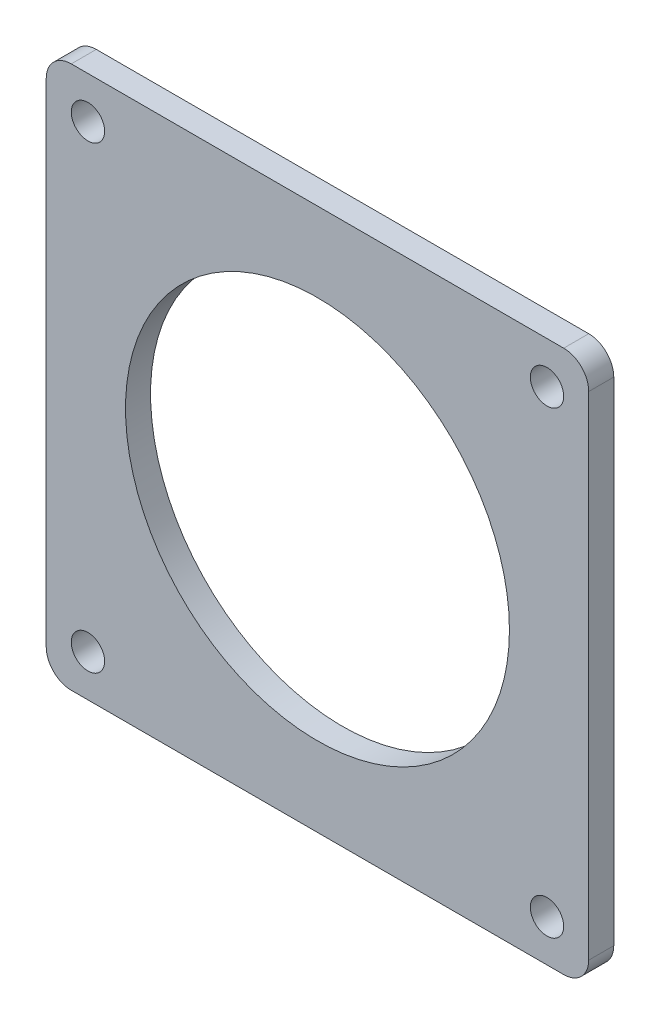
ISO-10303-21;
HEADER;
FILE_DESCRIPTION(('STEP AP214'),'2;1');
FILE_NAME('part.step','',(''),(''),'','','');
FILE_SCHEMA(('AUTOMOTIVE_DESIGN { 1 0 10303 214 1 1 1 1 }'));
ENDSEC;
DATA;
#1=APPLICATION_CONTEXT('core data for automotive mechanical design processes');
#2=APPLICATION_PROTOCOL_DEFINITION('international standard','automotive_design',2000,#1);
#3=PRODUCT_CONTEXT('',#1,'mechanical');
#4=PRODUCT('Part','Part','',(#3));
#5=PRODUCT_RELATED_PRODUCT_CATEGORY('part','',(#4));
#6=PRODUCT_DEFINITION_FORMATION('','',#4);
#7=PRODUCT_DEFINITION_CONTEXT('part definition',#1,'design');
#8=PRODUCT_DEFINITION('design','',#6,#7);
#9=PRODUCT_DEFINITION_SHAPE('','',#8);
#10=(LENGTH_UNIT() NAMED_UNIT(*) SI_UNIT(.MILLI.,.METRE.));
#11=(NAMED_UNIT(*) PLANE_ANGLE_UNIT() SI_UNIT($,.RADIAN.));
#12=(NAMED_UNIT(*) SI_UNIT($,.STERADIAN.) SOLID_ANGLE_UNIT());
#13=UNCERTAINTY_MEASURE_WITH_UNIT(LENGTH_MEASURE(1.E-05),#10,'distance_accuracy_value','');
#14=(GEOMETRIC_REPRESENTATION_CONTEXT(3) GLOBAL_UNCERTAINTY_ASSIGNED_CONTEXT((#13)) GLOBAL_UNIT_ASSIGNED_CONTEXT((#10,
#11,#12)) REPRESENTATION_CONTEXT('',''));
#15=CARTESIAN_POINT('',(0.,0.,0.));
#16=DIRECTION('',(0.,0.,1.));
#17=DIRECTION('',(1.,0.,0.));
#18=AXIS2_PLACEMENT_3D('',#15,#16,#17);
#19=CARTESIAN_POINT('',(0.,0.,3.));
#20=DIRECTION('',(0.,0.,1.));
#21=DIRECTION('',(1.,0.,0.));
#22=AXIS2_PLACEMENT_3D('',#19,#20,#21);
#23=PLANE('',#22);
#24=CARTESIAN_POINT('',(-27.5,-27.5,3.));
#25=DIRECTION('',(0.,0.,1.));
#26=DIRECTION('',(1.,0.,0.));
#27=AXIS2_PLACEMENT_3D('',#24,#25,#26);
#28=CIRCLE('',#27,2.);
#29=CARTESIAN_POINT('',(-25.5,-27.5,3.));
#30=VERTEX_POINT('',#29);
#31=EDGE_CURVE('E232',#30,#30,#28,.T.);
#32=ORIENTED_EDGE('',*,*,#31,.F.);
#33=EDGE_LOOP('',(#32));
#34=FACE_BOUND('',#33,.T.);
#35=CARTESIAN_POINT('',(27.5,27.5,3.));
#36=DIRECTION('',(0.,0.,1.));
#37=DIRECTION('',(1.,0.,0.));
#38=AXIS2_PLACEMENT_3D('',#35,#36,#37);
#39=CIRCLE('',#38,2.);
#40=CARTESIAN_POINT('',(29.5,27.5,3.));
#41=VERTEX_POINT('',#40);
#42=EDGE_CURVE('E218',#41,#41,#39,.T.);
#43=ORIENTED_EDGE('',*,*,#42,.F.);
#44=EDGE_LOOP('',(#43));
#45=FACE_BOUND('',#44,.T.);
#46=DIRECTION('',(-1.,0.,0.));
#47=VECTOR('',#46,1.);
#48=CARTESIAN_POINT('',(-32.5,32.5,3.));
#49=LINE('',#48,#47);
#50=CARTESIAN_POINT('',(29.5,32.5,3.));
#51=VERTEX_POINT('',#50);
#52=CARTESIAN_POINT('',(-29.5,32.5,3.));
#53=VERTEX_POINT('',#52);
#54=EDGE_CURVE('E198',#51,#53,#49,.T.);
#55=ORIENTED_EDGE('',*,*,#54,.T.);
#56=CARTESIAN_POINT('',(-29.5,29.5,3.));
#57=DIRECTION('',(0.,0.,1.));
#58=DIRECTION('',(1.,0.,0.));
#59=AXIS2_PLACEMENT_3D('',#56,#57,#58);
#60=CIRCLE('',#59,3.);
#61=CARTESIAN_POINT('',(-32.5,29.5,3.));
#62=VERTEX_POINT('',#61);
#63=EDGE_CURVE('E174',#53,#62,#60,.T.);
#64=ORIENTED_EDGE('',*,*,#63,.T.);
#65=DIRECTION('',(0.,-1.,0.));
#66=VECTOR('',#65,1.);
#67=CARTESIAN_POINT('',(-32.5,32.5,3.));
#68=LINE('',#67,#66);
#69=CARTESIAN_POINT('',(-32.5,-29.5,3.));
#70=VERTEX_POINT('',#69);
#71=EDGE_CURVE('E131',#62,#70,#68,.T.);
#72=ORIENTED_EDGE('',*,*,#71,.T.);
#73=CARTESIAN_POINT('',(-29.5,-29.5,3.));
#74=DIRECTION('',(0.,0.,1.));
#75=DIRECTION('',(1.,0.,0.));
#76=AXIS2_PLACEMENT_3D('',#73,#74,#75);
#77=CIRCLE('',#76,3.);
#78=CARTESIAN_POINT('',(-29.5,-32.5,3.));
#79=VERTEX_POINT('',#78);
#80=EDGE_CURVE('E66',#70,#79,#77,.T.);
#81=ORIENTED_EDGE('',*,*,#80,.T.);
#82=DIRECTION('',(1.,0.,0.));
#83=VECTOR('',#82,1.);
#84=CARTESIAN_POINT('',(-32.5,-32.5,3.));
#85=LINE('',#84,#83);
#86=CARTESIAN_POINT('',(29.5,-32.5,3.));
#87=VERTEX_POINT('',#86);
#88=EDGE_CURVE('E152',#79,#87,#85,.T.);
#89=ORIENTED_EDGE('',*,*,#88,.T.);
#90=CARTESIAN_POINT('',(29.5,-29.5,3.));
#91=DIRECTION('',(0.,0.,1.));
#92=DIRECTION('',(1.,0.,0.));
#93=AXIS2_PLACEMENT_3D('',#90,#91,#92);
#94=CIRCLE('',#93,3.);
#95=CARTESIAN_POINT('',(32.5,-29.5,3.));
#96=VERTEX_POINT('',#95);
#97=EDGE_CURVE('E169',#87,#96,#94,.T.);
#98=ORIENTED_EDGE('',*,*,#97,.T.);
#99=DIRECTION('',(0.,1.,0.));
#100=VECTOR('',#99,1.);
#101=CARTESIAN_POINT('',(32.5,32.5,3.));
#102=LINE('',#101,#100);
#103=CARTESIAN_POINT('',(32.5,29.5,3.));
#104=VERTEX_POINT('',#103);
#105=EDGE_CURVE('E145',#96,#104,#102,.T.);
#106=ORIENTED_EDGE('',*,*,#105,.T.);
#107=CARTESIAN_POINT('',(29.5,29.5,3.));
#108=DIRECTION('',(0.,0.,1.));
#109=DIRECTION('',(1.,0.,0.));
#110=AXIS2_PLACEMENT_3D('',#107,#108,#109);
#111=CIRCLE('',#110,3.);
#112=EDGE_CURVE('E166',#104,#51,#111,.T.);
#113=ORIENTED_EDGE('',*,*,#112,.T.);
#114=EDGE_LOOP('',(#55,#64,#72,#81,#89,#98,#106,#113));
#115=FACE_BOUND('',#114,.T.);
#116=CARTESIAN_POINT('',(-27.5,27.5,3.));
#117=DIRECTION('',(0.,0.,1.));
#118=DIRECTION('',(1.,0.,0.));
#119=AXIS2_PLACEMENT_3D('',#116,#117,#118);
#120=CIRCLE('',#119,2.);
#121=CARTESIAN_POINT('',(-25.5,27.5,3.));
#122=VERTEX_POINT('',#121);
#123=EDGE_CURVE('E204',#122,#122,#120,.T.);
#124=ORIENTED_EDGE('',*,*,#123,.F.);
#125=EDGE_LOOP('',(#124));
#126=FACE_BOUND('',#125,.T.);
#127=CARTESIAN_POINT('',(27.5,-27.5,3.));
#128=DIRECTION('',(0.,0.,1.));
#129=DIRECTION('',(1.,0.,0.));
#130=AXIS2_PLACEMENT_3D('',#127,#128,#129);
#131=CIRCLE('',#130,2.);
#132=CARTESIAN_POINT('',(29.5,-27.5,3.));
#133=VERTEX_POINT('',#132);
#134=EDGE_CURVE('E224',#133,#133,#131,.T.);
#135=ORIENTED_EDGE('',*,*,#134,.F.);
#136=EDGE_LOOP('',(#135));
#137=FACE_BOUND('',#136,.T.);
#138=CARTESIAN_POINT('',(0.,0.,3.));
#139=DIRECTION('',(0.,0.,1.));
#140=DIRECTION('',(1.,0.,0.));
#141=AXIS2_PLACEMENT_3D('',#138,#139,#140);
#142=CIRCLE('',#141,23.);
#143=CARTESIAN_POINT('',(23.,0.,3.));
#144=VERTEX_POINT('',#143);
#145=EDGE_CURVE('E240',#144,#144,#142,.T.);
#146=ORIENTED_EDGE('',*,*,#145,.F.);
#147=EDGE_LOOP('',(#146));
#148=FACE_BOUND('',#147,.T.);
#149=ADVANCED_FACE('F43',(#34,#45,#115,#126,#137,#148),#23,.T.);
#150=CARTESIAN_POINT('',(0.,0.,0.));
#151=DIRECTION('',(0.,0.,1.));
#152=DIRECTION('',(1.,0.,0.));
#153=AXIS2_PLACEMENT_3D('',#150,#151,#152);
#154=PLANE('',#153);
#155=DIRECTION('',(0.,-1.,0.));
#156=VECTOR('',#155,1.);
#157=CARTESIAN_POINT('',(-32.5,32.5,0.));
#158=LINE('',#157,#156);
#159=CARTESIAN_POINT('',(-32.5,29.5,0.));
#160=VERTEX_POINT('',#159);
#161=CARTESIAN_POINT('',(-32.5,-29.5,0.));
#162=VERTEX_POINT('',#161);
#163=EDGE_CURVE('E129',#160,#162,#158,.T.);
#164=ORIENTED_EDGE('',*,*,#163,.F.);
#165=CARTESIAN_POINT('',(-29.5,29.5,0.));
#166=DIRECTION('',(0.,0.,1.));
#167=DIRECTION('',(1.,0.,0.));
#168=AXIS2_PLACEMENT_3D('',#165,#166,#167);
#169=CIRCLE('',#168,3.);
#170=CARTESIAN_POINT('',(-29.5,32.5,0.));
#171=VERTEX_POINT('',#170);
#172=EDGE_CURVE('E111',#160,#171,#169,.F.);
#173=ORIENTED_EDGE('',*,*,#172,.T.);
#174=DIRECTION('',(-1.,0.,0.));
#175=VECTOR('',#174,1.);
#176=CARTESIAN_POINT('',(-32.5,32.5,0.));
#177=LINE('',#176,#175);
#178=CARTESIAN_POINT('',(29.5,32.5,0.));
#179=VERTEX_POINT('',#178);
#180=EDGE_CURVE('E141',#179,#171,#177,.T.);
#181=ORIENTED_EDGE('',*,*,#180,.F.);
#182=CARTESIAN_POINT('',(29.5,29.5,0.));
#183=DIRECTION('',(0.,0.,1.));
#184=DIRECTION('',(1.,0.,0.));
#185=AXIS2_PLACEMENT_3D('',#182,#183,#184);
#186=CIRCLE('',#185,3.);
#187=CARTESIAN_POINT('',(32.5,29.5,0.));
#188=VERTEX_POINT('',#187);
#189=EDGE_CURVE('E133',#179,#188,#186,.F.);
#190=ORIENTED_EDGE('',*,*,#189,.T.);
#191=DIRECTION('',(0.,1.,0.));
#192=VECTOR('',#191,1.);
#193=CARTESIAN_POINT('',(32.5,32.5,0.));
#194=LINE('',#193,#192);
#195=CARTESIAN_POINT('',(32.5,-29.5,0.));
#196=VERTEX_POINT('',#195);
#197=EDGE_CURVE('E147',#196,#188,#194,.T.);
#198=ORIENTED_EDGE('',*,*,#197,.F.);
#199=CARTESIAN_POINT('',(29.5,-29.5,0.));
#200=DIRECTION('',(0.,0.,1.));
#201=DIRECTION('',(1.,0.,0.));
#202=AXIS2_PLACEMENT_3D('',#199,#200,#201);
#203=CIRCLE('',#202,3.);
#204=CARTESIAN_POINT('',(29.5,-32.5,0.));
#205=VERTEX_POINT('',#204);
#206=EDGE_CURVE('E156',#196,#205,#203,.F.);
#207=ORIENTED_EDGE('',*,*,#206,.T.);
#208=DIRECTION('',(1.,0.,0.));
#209=VECTOR('',#208,1.);
#210=CARTESIAN_POINT('',(-32.5,-32.5,0.));
#211=LINE('',#210,#209);
#212=CARTESIAN_POINT('',(-29.5,-32.5,0.));
#213=VERTEX_POINT('',#212);
#214=EDGE_CURVE('E140',#213,#205,#211,.T.);
#215=ORIENTED_EDGE('',*,*,#214,.F.);
#216=CARTESIAN_POINT('',(-29.5,-29.5,0.));
#217=DIRECTION('',(0.,0.,1.));
#218=DIRECTION('',(1.,0.,0.));
#219=AXIS2_PLACEMENT_3D('',#216,#217,#218);
#220=CIRCLE('',#219,3.);
#221=EDGE_CURVE('E123',#213,#162,#220,.F.);
#222=ORIENTED_EDGE('',*,*,#221,.T.);
#223=EDGE_LOOP('',(#164,#173,#181,#190,#198,#207,#215,#222));
#224=FACE_BOUND('',#223,.T.);
#225=CARTESIAN_POINT('',(-27.5,27.5,0.));
#226=DIRECTION('',(0.,0.,1.));
#227=DIRECTION('',(1.,0.,0.));
#228=AXIS2_PLACEMENT_3D('',#225,#226,#227);
#229=CIRCLE('',#228,2.);
#230=CARTESIAN_POINT('',(-25.5,27.5,0.));
#231=VERTEX_POINT('',#230);
#232=EDGE_CURVE('E207',#231,#231,#229,.T.);
#233=ORIENTED_EDGE('',*,*,#232,.T.);
#234=EDGE_LOOP('',(#233));
#235=FACE_BOUND('',#234,.T.);
#236=CARTESIAN_POINT('',(27.5,27.5,0.));
#237=DIRECTION('',(0.,0.,1.));
#238=DIRECTION('',(1.,0.,0.));
#239=AXIS2_PLACEMENT_3D('',#236,#237,#238);
#240=CIRCLE('',#239,2.);
#241=CARTESIAN_POINT('',(29.5,27.5,0.));
#242=VERTEX_POINT('',#241);
#243=EDGE_CURVE('E220',#242,#242,#240,.T.);
#244=ORIENTED_EDGE('',*,*,#243,.T.);
#245=EDGE_LOOP('',(#244));
#246=FACE_BOUND('',#245,.T.);
#247=CARTESIAN_POINT('',(27.5,-27.5,0.));
#248=DIRECTION('',(0.,0.,1.));
#249=DIRECTION('',(1.,0.,0.));
#250=AXIS2_PLACEMENT_3D('',#247,#248,#249);
#251=CIRCLE('',#250,2.);
#252=CARTESIAN_POINT('',(29.5,-27.5,0.));
#253=VERTEX_POINT('',#252);
#254=EDGE_CURVE('E228',#253,#253,#251,.T.);
#255=ORIENTED_EDGE('',*,*,#254,.T.);
#256=EDGE_LOOP('',(#255));
#257=FACE_BOUND('',#256,.T.);
#258=CARTESIAN_POINT('',(-27.5,-27.5,0.));
#259=DIRECTION('',(0.,0.,1.));
#260=DIRECTION('',(1.,0.,0.));
#261=AXIS2_PLACEMENT_3D('',#258,#259,#260);
#262=CIRCLE('',#261,2.);
#263=CARTESIAN_POINT('',(-25.5,-27.5,0.));
#264=VERTEX_POINT('',#263);
#265=EDGE_CURVE('E236',#264,#264,#262,.T.);
#266=ORIENTED_EDGE('',*,*,#265,.T.);
#267=EDGE_LOOP('',(#266));
#268=FACE_BOUND('',#267,.T.);
#269=CARTESIAN_POINT('',(0.,0.,0.));
#270=DIRECTION('',(0.,0.,1.));
#271=DIRECTION('',(1.,0.,0.));
#272=AXIS2_PLACEMENT_3D('',#269,#270,#271);
#273=CIRCLE('',#272,23.);
#274=CARTESIAN_POINT('',(23.,0.,0.));
#275=VERTEX_POINT('',#274);
#276=EDGE_CURVE('E244',#275,#275,#273,.T.);
#277=ORIENTED_EDGE('',*,*,#276,.T.);
#278=EDGE_LOOP('',(#277));
#279=FACE_BOUND('',#278,.T.);
#280=ADVANCED_FACE('F136',(#224,#235,#246,#257,#268,#279),#154,.F.);
#281=CARTESIAN_POINT('',(32.5,32.5,3.));
#282=DIRECTION('',(-1.,0.,0.));
#283=DIRECTION('',(0.,-1.,0.));
#284=AXIS2_PLACEMENT_3D('',#281,#282,#283);
#285=PLANE('',#284);
#286=ORIENTED_EDGE('',*,*,#105,.F.);
#287=DIRECTION('',(0.,0.,-1.));
#288=VECTOR('',#287,1.);
#289=CARTESIAN_POINT('',(32.5,-29.5,3.));
#290=LINE('',#289,#288);
#291=EDGE_CURVE('E11',#96,#196,#290,.T.);
#292=ORIENTED_EDGE('',*,*,#291,.T.);
#293=ORIENTED_EDGE('',*,*,#197,.T.);
#294=DIRECTION('',(0.,0.,-1.));
#295=VECTOR('',#294,1.);
#296=CARTESIAN_POINT('',(32.5,29.5,3.));
#297=LINE('',#296,#295);
#298=EDGE_CURVE('E52',#188,#104,#297,.F.);
#299=ORIENTED_EDGE('',*,*,#298,.T.);
#300=EDGE_LOOP('',(#286,#292,#293,#299));
#301=FACE_BOUND('',#300,.T.);
#302=ADVANCED_FACE('F188',(#301),#285,.F.);
#303=CARTESIAN_POINT('',(-32.5,32.5,3.));
#304=DIRECTION('',(0.,-1.,0.));
#305=DIRECTION('',(0.,0.,-1.));
#306=AXIS2_PLACEMENT_3D('',#303,#304,#305);
#307=PLANE('',#306);
#308=ORIENTED_EDGE('',*,*,#180,.T.);
#309=DIRECTION('',(0.,0.,-1.));
#310=VECTOR('',#309,1.);
#311=CARTESIAN_POINT('',(-29.5,32.5,3.));
#312=LINE('',#311,#310);
#313=EDGE_CURVE('E116',#171,#53,#312,.F.);
#314=ORIENTED_EDGE('',*,*,#313,.T.);
#315=ORIENTED_EDGE('',*,*,#54,.F.);
#316=DIRECTION('',(0.,0.,-1.));
#317=VECTOR('',#316,1.);
#318=CARTESIAN_POINT('',(29.5,32.5,3.));
#319=LINE('',#318,#317);
#320=EDGE_CURVE('E122',#51,#179,#319,.T.);
#321=ORIENTED_EDGE('',*,*,#320,.T.);
#322=EDGE_LOOP('',(#308,#314,#315,#321));
#323=FACE_BOUND('',#322,.T.);
#324=ADVANCED_FACE('F202',(#323),#307,.F.);
#325=CARTESIAN_POINT('',(-32.5,32.5,3.));
#326=DIRECTION('',(1.,0.,0.));
#327=DIRECTION('',(0.,0.,-1.));
#328=AXIS2_PLACEMENT_3D('',#325,#326,#327);
#329=PLANE('',#328);
#330=ORIENTED_EDGE('',*,*,#71,.F.);
#331=DIRECTION('',(0.,0.,-1.));
#332=VECTOR('',#331,1.);
#333=CARTESIAN_POINT('',(-32.5,29.5,3.));
#334=LINE('',#333,#332);
#335=EDGE_CURVE('E115',#62,#160,#334,.T.);
#336=ORIENTED_EDGE('',*,*,#335,.T.);
#337=ORIENTED_EDGE('',*,*,#163,.T.);
#338=DIRECTION('',(0.,0.,-1.));
#339=VECTOR('',#338,1.);
#340=CARTESIAN_POINT('',(-32.5,-29.5,3.));
#341=LINE('',#340,#339);
#342=EDGE_CURVE('E134',#162,#70,#341,.F.);
#343=ORIENTED_EDGE('',*,*,#342,.T.);
#344=EDGE_LOOP('',(#330,#336,#337,#343));
#345=FACE_BOUND('',#344,.T.);
#346=ADVANCED_FACE('F128',(#345),#329,.F.);
#347=CARTESIAN_POINT('',(-32.5,-32.5,3.));
#348=DIRECTION('',(0.,1.,0.));
#349=DIRECTION('',(0.,0.,1.));
#350=AXIS2_PLACEMENT_3D('',#347,#348,#349);
#351=PLANE('',#350);
#352=ORIENTED_EDGE('',*,*,#88,.F.);
#353=DIRECTION('',(0.,0.,-1.));
#354=VECTOR('',#353,1.);
#355=CARTESIAN_POINT('',(-29.5,-32.5,3.));
#356=LINE('',#355,#354);
#357=EDGE_CURVE('E179',#79,#213,#356,.T.);
#358=ORIENTED_EDGE('',*,*,#357,.T.);
#359=ORIENTED_EDGE('',*,*,#214,.T.);
#360=DIRECTION('',(0.,0.,-1.));
#361=VECTOR('',#360,1.);
#362=CARTESIAN_POINT('',(29.5,-32.5,3.));
#363=LINE('',#362,#361);
#364=EDGE_CURVE('E59',#205,#87,#363,.F.);
#365=ORIENTED_EDGE('',*,*,#364,.T.);
#366=EDGE_LOOP('',(#352,#358,#359,#365));
#367=FACE_BOUND('',#366,.T.);
#368=ADVANCED_FACE('F268',(#367),#351,.F.);
#369=CARTESIAN_POINT('',(-27.5,27.5,3.));
#370=DIRECTION('',(0.,0.,-1.));
#371=DIRECTION('',(-1.,0.,0.));
#372=AXIS2_PLACEMENT_3D('',#369,#370,#371);
#373=CYLINDRICAL_SURFACE('',#372,2.);
#374=ORIENTED_EDGE('',*,*,#123,.T.);
#375=EDGE_LOOP('',(#374));
#376=FACE_BOUND('',#375,.T.);
#377=ORIENTED_EDGE('',*,*,#232,.F.);
#378=EDGE_LOOP('',(#377));
#379=FACE_BOUND('',#378,.T.);
#380=ADVANCED_FACE('F265',(#376,#379),#373,.F.);
#381=CARTESIAN_POINT('',(27.5,27.5,3.));
#382=DIRECTION('',(0.,0.,-1.));
#383=DIRECTION('',(-1.,0.,0.));
#384=AXIS2_PLACEMENT_3D('',#381,#382,#383);
#385=CYLINDRICAL_SURFACE('',#384,2.);
#386=ORIENTED_EDGE('',*,*,#42,.T.);
#387=EDGE_LOOP('',(#386));
#388=FACE_BOUND('',#387,.T.);
#389=ORIENTED_EDGE('',*,*,#243,.F.);
#390=EDGE_LOOP('',(#389));
#391=FACE_BOUND('',#390,.T.);
#392=ADVANCED_FACE('F382',(#388,#391),#385,.F.);
#393=CARTESIAN_POINT('',(27.5,-27.5,3.));
#394=DIRECTION('',(0.,0.,-1.));
#395=DIRECTION('',(-1.,0.,0.));
#396=AXIS2_PLACEMENT_3D('',#393,#394,#395);
#397=CYLINDRICAL_SURFACE('',#396,2.);
#398=ORIENTED_EDGE('',*,*,#134,.T.);
#399=EDGE_LOOP('',(#398));
#400=FACE_BOUND('',#399,.T.);
#401=ORIENTED_EDGE('',*,*,#254,.F.);
#402=EDGE_LOOP('',(#401));
#403=FACE_BOUND('',#402,.T.);
#404=ADVANCED_FACE('F371',(#400,#403),#397,.F.);
#405=CARTESIAN_POINT('',(-27.5,-27.5,3.));
#406=DIRECTION('',(0.,0.,-1.));
#407=DIRECTION('',(-1.,0.,0.));
#408=AXIS2_PLACEMENT_3D('',#405,#406,#407);
#409=CYLINDRICAL_SURFACE('',#408,2.);
#410=ORIENTED_EDGE('',*,*,#31,.T.);
#411=EDGE_LOOP('',(#410));
#412=FACE_BOUND('',#411,.T.);
#413=ORIENTED_EDGE('',*,*,#265,.F.);
#414=EDGE_LOOP('',(#413));
#415=FACE_BOUND('',#414,.T.);
#416=ADVANCED_FACE('F361',(#412,#415),#409,.F.);
#417=CARTESIAN_POINT('',(0.,0.,3.));
#418=DIRECTION('',(0.,0.,-1.));
#419=DIRECTION('',(-1.,0.,0.));
#420=AXIS2_PLACEMENT_3D('',#417,#418,#419);
#421=CYLINDRICAL_SURFACE('',#420,23.);
#422=ORIENTED_EDGE('',*,*,#145,.T.);
#423=EDGE_LOOP('',(#422));
#424=FACE_BOUND('',#423,.T.);
#425=ORIENTED_EDGE('',*,*,#276,.F.);
#426=EDGE_LOOP('',(#425));
#427=FACE_BOUND('',#426,.T.);
#428=ADVANCED_FACE('F252',(#424,#427),#421,.F.);
#429=CARTESIAN_POINT('',(-29.5,29.5,3.));
#430=DIRECTION('',(0.,0.,-1.));
#431=DIRECTION('',(-1.,0.,0.));
#432=AXIS2_PLACEMENT_3D('',#429,#430,#431);
#433=CYLINDRICAL_SURFACE('',#432,3.);
#434=ORIENTED_EDGE('',*,*,#63,.F.);
#435=ORIENTED_EDGE('',*,*,#313,.F.);
#436=ORIENTED_EDGE('',*,*,#172,.F.);
#437=ORIENTED_EDGE('',*,*,#335,.F.);
#438=EDGE_LOOP('',(#434,#435,#436,#437));
#439=FACE_BOUND('',#438,.T.);
#440=ADVANCED_FACE('F114',(#439),#433,.T.);
#441=CARTESIAN_POINT('',(-29.5,-29.5,3.));
#442=DIRECTION('',(0.,0.,-1.));
#443=DIRECTION('',(-1.,0.,0.));
#444=AXIS2_PLACEMENT_3D('',#441,#442,#443);
#445=CYLINDRICAL_SURFACE('',#444,3.);
#446=ORIENTED_EDGE('',*,*,#80,.F.);
#447=ORIENTED_EDGE('',*,*,#342,.F.);
#448=ORIENTED_EDGE('',*,*,#221,.F.);
#449=ORIENTED_EDGE('',*,*,#357,.F.);
#450=EDGE_LOOP('',(#446,#447,#448,#449));
#451=FACE_BOUND('',#450,.T.);
#452=ADVANCED_FACE('F279',(#451),#445,.T.);
#453=CARTESIAN_POINT('',(29.5,-29.5,3.));
#454=DIRECTION('',(0.,0.,-1.));
#455=DIRECTION('',(-1.,0.,0.));
#456=AXIS2_PLACEMENT_3D('',#453,#454,#455);
#457=CYLINDRICAL_SURFACE('',#456,3.);
#458=ORIENTED_EDGE('',*,*,#97,.F.);
#459=ORIENTED_EDGE('',*,*,#364,.F.);
#460=ORIENTED_EDGE('',*,*,#206,.F.);
#461=ORIENTED_EDGE('',*,*,#291,.F.);
#462=EDGE_LOOP('',(#458,#459,#460,#461));
#463=FACE_BOUND('',#462,.T.);
#464=ADVANCED_FACE('F281',(#463),#457,.T.);
#465=CARTESIAN_POINT('',(29.5,29.5,3.));
#466=DIRECTION('',(0.,0.,-1.));
#467=DIRECTION('',(-1.,0.,0.));
#468=AXIS2_PLACEMENT_3D('',#465,#466,#467);
#469=CYLINDRICAL_SURFACE('',#468,3.);
#470=ORIENTED_EDGE('',*,*,#112,.F.);
#471=ORIENTED_EDGE('',*,*,#298,.F.);
#472=ORIENTED_EDGE('',*,*,#189,.F.);
#473=ORIENTED_EDGE('',*,*,#320,.F.);
#474=EDGE_LOOP('',(#470,#471,#472,#473));
#475=FACE_BOUND('',#474,.T.);
#476=ADVANCED_FACE('F45',(#475),#469,.T.);
#477=CLOSED_SHELL('',(#149,#280,#302,#324,#346,#368,#380,#392,#404,#416,#428,#440,#452,#464,#476));
#478=MANIFOLD_SOLID_BREP('B2',#477);
#479=ADVANCED_BREP_SHAPE_REPRESENTATION('',(#18,#478),#14);
#480=SHAPE_DEFINITION_REPRESENTATION(#9,#479);
ENDSEC;
END-ISO-10303-21;
